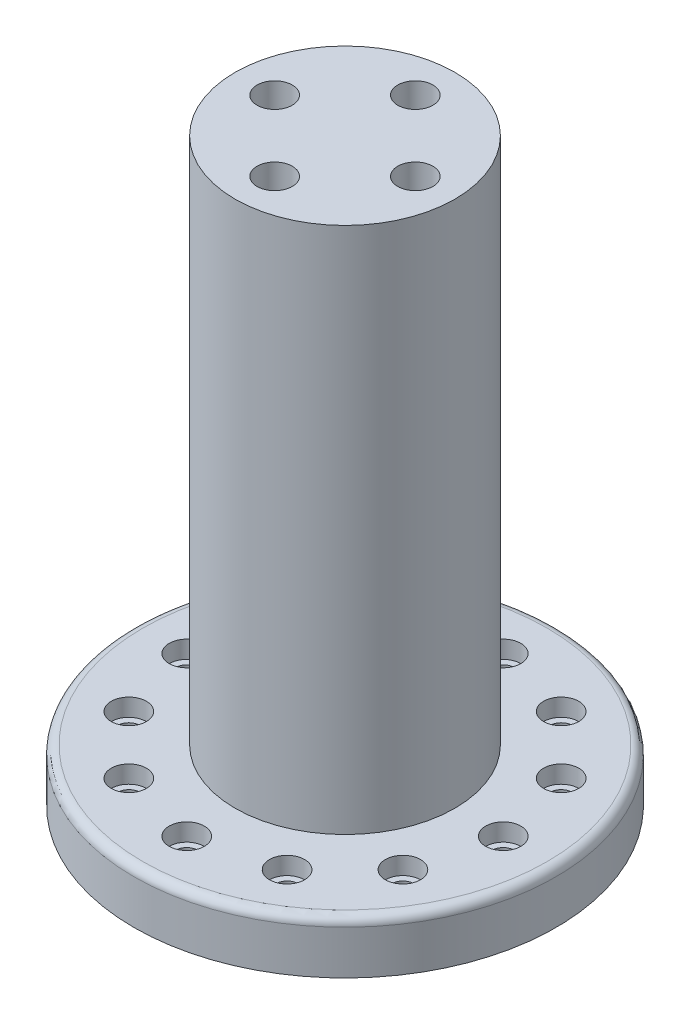
ISO-10303-21;
HEADER;
FILE_DESCRIPTION(('STEP AP214'),'2;1');
FILE_NAME('part.step','',(''),(''),'','','');
FILE_SCHEMA(('AUTOMOTIVE_DESIGN { 1 0 10303 214 1 1 1 1 }'));
ENDSEC;
DATA;
#1=APPLICATION_CONTEXT('core data for automotive mechanical design processes');
#2=APPLICATION_PROTOCOL_DEFINITION('international standard','automotive_design',2000,#1);
#3=PRODUCT_CONTEXT('',#1,'mechanical');
#4=PRODUCT('Part','Part','',(#3));
#5=PRODUCT_RELATED_PRODUCT_CATEGORY('part','',(#4));
#6=PRODUCT_DEFINITION_FORMATION('','',#4);
#7=PRODUCT_DEFINITION_CONTEXT('part definition',#1,'design');
#8=PRODUCT_DEFINITION('design','',#6,#7);
#9=PRODUCT_DEFINITION_SHAPE('','',#8);
#10=(LENGTH_UNIT() NAMED_UNIT(*) SI_UNIT(.MILLI.,.METRE.));
#11=(NAMED_UNIT(*) PLANE_ANGLE_UNIT() SI_UNIT($,.RADIAN.));
#12=(NAMED_UNIT(*) SI_UNIT($,.STERADIAN.) SOLID_ANGLE_UNIT());
#13=UNCERTAINTY_MEASURE_WITH_UNIT(LENGTH_MEASURE(1.E-05),#10,'distance_accuracy_value','');
#14=(GEOMETRIC_REPRESENTATION_CONTEXT(3) GLOBAL_UNCERTAINTY_ASSIGNED_CONTEXT((#13)) GLOBAL_UNIT_ASSIGNED_CONTEXT((#10,
#11,#12)) REPRESENTATION_CONTEXT('',''));
#15=CARTESIAN_POINT('',(0.,0.,0.));
#16=DIRECTION('',(0.,0.,1.));
#17=DIRECTION('',(1.,0.,0.));
#18=AXIS2_PLACEMENT_3D('',#15,#16,#17);
#19=CARTESIAN_POINT('',(0.,6.,0.));
#20=DIRECTION('',(0.,-1.,0.));
#21=DIRECTION('',(0.,0.,-1.));
#22=AXIS2_PLACEMENT_3D('',#19,#20,#21);
#23=CYLINDRICAL_SURFACE('',#22,24.);
#24=CARTESIAN_POINT('',(0.,5.,0.));
#25=DIRECTION('',(0.,1.,0.));
#26=DIRECTION('',(0.,0.,1.));
#27=AXIS2_PLACEMENT_3D('',#24,#25,#26);
#28=CIRCLE('',#27,24.);
#29=CARTESIAN_POINT('',(0.,5.,24.));
#30=VERTEX_POINT('',#29);
#31=EDGE_CURVE('E10',#30,#30,#28,.F.);
#32=ORIENTED_EDGE('',*,*,#31,.T.);
#33=EDGE_LOOP('',(#32));
#34=FACE_BOUND('',#33,.T.);
#35=CARTESIAN_POINT('',(0.,0.,0.));
#36=DIRECTION('',(0.,1.,0.));
#37=DIRECTION('',(0.,0.,1.));
#38=AXIS2_PLACEMENT_3D('',#35,#36,#37);
#39=CIRCLE('',#38,24.);
#40=CARTESIAN_POINT('',(0.,0.,24.));
#41=VERTEX_POINT('',#40);
#42=EDGE_CURVE('E43',#41,#41,#39,.T.);
#43=ORIENTED_EDGE('',*,*,#42,.T.);
#44=EDGE_LOOP('',(#43));
#45=FACE_BOUND('',#44,.T.);
#46=ADVANCED_FACE('F32',(#34,#45),#23,.T.);
#47=CARTESIAN_POINT('',(0.,6.,0.));
#48=DIRECTION('',(0.,1.,0.));
#49=DIRECTION('',(0.,0.,1.));
#50=AXIS2_PLACEMENT_3D('',#47,#48,#49);
#51=PLANE('',#50);
#52=CARTESIAN_POINT('',(0.,6.,0.));
#53=DIRECTION('',(0.,1.,0.));
#54=DIRECTION('',(0.,0.,1.));
#55=AXIS2_PLACEMENT_3D('',#52,#53,#54);
#56=CIRCLE('',#55,23.);
#57=CARTESIAN_POINT('',(0.,6.,23.));
#58=VERTEX_POINT('',#57);
#59=EDGE_CURVE('E39',#58,#58,#56,.T.);
#60=ORIENTED_EDGE('',*,*,#59,.T.);
#61=EDGE_LOOP('',(#60));
#62=FACE_BOUND('',#61,.T.);
#63=CARTESIAN_POINT('',(0.,6.,0.));
#64=DIRECTION('',(0.,1.,0.));
#65=DIRECTION('',(0.,0.,1.));
#66=AXIS2_PLACEMENT_3D('',#63,#64,#65);
#67=CIRCLE('',#66,12.5);
#68=CARTESIAN_POINT('',(0.,6.,12.5));
#69=VERTEX_POINT('',#68);
#70=EDGE_CURVE('E194',#69,#69,#67,.T.);
#71=ORIENTED_EDGE('',*,*,#70,.F.);
#72=EDGE_LOOP('',(#71));
#73=FACE_BOUND('',#72,.T.);
#74=CARTESIAN_POINT('',(-15.5884572681199,6.,9.00000000000001));
#75=DIRECTION('',(0.,1.,0.));
#76=DIRECTION('',(0.,0.,1.));
#77=AXIS2_PLACEMENT_3D('',#74,#75,#76);
#78=CIRCLE('',#77,2.);
#79=CARTESIAN_POINT('',(-15.5884572681199,6.,11.));
#80=VERTEX_POINT('',#79);
#81=EDGE_CURVE('E80',#80,#80,#78,.T.);
#82=ORIENTED_EDGE('',*,*,#81,.F.);
#83=EDGE_LOOP('',(#82));
#84=FACE_BOUND('',#83,.T.);
#85=CARTESIAN_POINT('',(-8.99999999999999,6.,15.5884572681199));
#86=DIRECTION('',(0.,1.,0.));
#87=DIRECTION('',(0.,0.,1.));
#88=AXIS2_PLACEMENT_3D('',#85,#86,#87);
#89=CIRCLE('',#88,2.);
#90=CARTESIAN_POINT('',(-8.99999999999999,6.,17.5884572681199));
#91=VERTEX_POINT('',#90);
#92=EDGE_CURVE('E87',#91,#91,#89,.T.);
#93=ORIENTED_EDGE('',*,*,#92,.F.);
#94=EDGE_LOOP('',(#93));
#95=FACE_BOUND('',#94,.T.);
#96=CARTESIAN_POINT('',(0.,6.,18.));
#97=DIRECTION('',(0.,1.,0.));
#98=DIRECTION('',(0.,0.,1.));
#99=AXIS2_PLACEMENT_3D('',#96,#97,#98);
#100=CIRCLE('',#99,2.);
#101=CARTESIAN_POINT('',(0.,6.,20.));
#102=VERTEX_POINT('',#101);
#103=EDGE_CURVE('E93',#102,#102,#100,.T.);
#104=ORIENTED_EDGE('',*,*,#103,.F.);
#105=EDGE_LOOP('',(#104));
#106=FACE_BOUND('',#105,.T.);
#107=CARTESIAN_POINT('',(9.00000000000001,6.,15.5884572681199));
#108=DIRECTION('',(0.,1.,0.));
#109=DIRECTION('',(0.,0.,1.));
#110=AXIS2_PLACEMENT_3D('',#107,#108,#109);
#111=CIRCLE('',#110,2.);
#112=CARTESIAN_POINT('',(9.00000000000001,6.,17.5884572681199));
#113=VERTEX_POINT('',#112);
#114=EDGE_CURVE('E99',#113,#113,#111,.T.);
#115=ORIENTED_EDGE('',*,*,#114,.F.);
#116=EDGE_LOOP('',(#115));
#117=FACE_BOUND('',#116,.T.);
#118=CARTESIAN_POINT('',(15.5884572681199,6.,8.99999999999999));
#119=DIRECTION('',(0.,1.,0.));
#120=DIRECTION('',(0.,0.,1.));
#121=AXIS2_PLACEMENT_3D('',#118,#119,#120);
#122=CIRCLE('',#121,2.);
#123=CARTESIAN_POINT('',(15.5884572681199,6.,11.));
#124=VERTEX_POINT('',#123);
#125=EDGE_CURVE('E56',#124,#124,#122,.T.);
#126=ORIENTED_EDGE('',*,*,#125,.F.);
#127=EDGE_LOOP('',(#126));
#128=FACE_BOUND('',#127,.T.);
#129=CARTESIAN_POINT('',(18.,6.,0.));
#130=DIRECTION('',(0.,1.,0.));
#131=DIRECTION('',(0.,0.,1.));
#132=AXIS2_PLACEMENT_3D('',#129,#130,#131);
#133=CIRCLE('',#132,2.);
#134=CARTESIAN_POINT('',(18.,6.,2.));
#135=VERTEX_POINT('',#134);
#136=EDGE_CURVE('E63',#135,#135,#133,.T.);
#137=ORIENTED_EDGE('',*,*,#136,.F.);
#138=EDGE_LOOP('',(#137));
#139=FACE_BOUND('',#138,.T.);
#140=CARTESIAN_POINT('',(15.5884572681199,6.,-9.));
#141=DIRECTION('',(0.,1.,0.));
#142=DIRECTION('',(0.,0.,1.));
#143=AXIS2_PLACEMENT_3D('',#140,#141,#142);
#144=CIRCLE('',#143,2.);
#145=CARTESIAN_POINT('',(15.5884572681199,6.,-7.));
#146=VERTEX_POINT('',#145);
#147=EDGE_CURVE('E69',#146,#146,#144,.T.);
#148=ORIENTED_EDGE('',*,*,#147,.F.);
#149=EDGE_LOOP('',(#148));
#150=FACE_BOUND('',#149,.T.);
#151=CARTESIAN_POINT('',(9.,6.,-15.5884572681199));
#152=DIRECTION('',(0.,1.,0.));
#153=DIRECTION('',(0.,0.,1.));
#154=AXIS2_PLACEMENT_3D('',#151,#152,#153);
#155=CIRCLE('',#154,2.);
#156=CARTESIAN_POINT('',(9.,6.,-13.5884572681199));
#157=VERTEX_POINT('',#156);
#158=EDGE_CURVE('E75',#157,#157,#155,.T.);
#159=ORIENTED_EDGE('',*,*,#158,.F.);
#160=EDGE_LOOP('',(#159));
#161=FACE_BOUND('',#160,.T.);
#162=CARTESIAN_POINT('',(-18.,6.,0.));
#163=DIRECTION('',(0.,1.,0.));
#164=DIRECTION('',(0.,0.,1.));
#165=AXIS2_PLACEMENT_3D('',#162,#163,#164);
#166=CIRCLE('',#165,2.);
#167=CARTESIAN_POINT('',(-18.,6.,2.));
#168=VERTEX_POINT('',#167);
#169=EDGE_CURVE('E117',#168,#168,#166,.T.);
#170=ORIENTED_EDGE('',*,*,#169,.F.);
#171=EDGE_LOOP('',(#170));
#172=FACE_BOUND('',#171,.T.);
#173=CARTESIAN_POINT('',(-15.5884572681199,6.,-8.99999999999999));
#174=DIRECTION('',(0.,1.,0.));
#175=DIRECTION('',(0.,0.,1.));
#176=AXIS2_PLACEMENT_3D('',#173,#174,#175);
#177=CIRCLE('',#176,2.);
#178=CARTESIAN_POINT('',(-15.5884572681199,6.,-6.99999999999999));
#179=VERTEX_POINT('',#178);
#180=EDGE_CURVE('E111',#179,#179,#177,.T.);
#181=ORIENTED_EDGE('',*,*,#180,.F.);
#182=EDGE_LOOP('',(#181));
#183=FACE_BOUND('',#182,.T.);
#184=CARTESIAN_POINT('',(-9.00000000000001,6.,-15.5884572681199));
#185=DIRECTION('',(0.,1.,0.));
#186=DIRECTION('',(0.,0.,1.));
#187=AXIS2_PLACEMENT_3D('',#184,#185,#186);
#188=CIRCLE('',#187,2.);
#189=CARTESIAN_POINT('',(-9.00000000000001,6.,-13.5884572681199));
#190=VERTEX_POINT('',#189);
#191=EDGE_CURVE('E104',#190,#190,#188,.T.);
#192=ORIENTED_EDGE('',*,*,#191,.F.);
#193=EDGE_LOOP('',(#192));
#194=FACE_BOUND('',#193,.T.);
#195=CARTESIAN_POINT('',(0.,6.,-18.));
#196=DIRECTION('',(0.,1.,0.));
#197=DIRECTION('',(0.,0.,1.));
#198=AXIS2_PLACEMENT_3D('',#195,#196,#197);
#199=CIRCLE('',#198,2.);
#200=CARTESIAN_POINT('',(0.,6.,-16.));
#201=VERTEX_POINT('',#200);
#202=EDGE_CURVE('E50',#201,#201,#199,.T.);
#203=ORIENTED_EDGE('',*,*,#202,.F.);
#204=EDGE_LOOP('',(#203));
#205=FACE_BOUND('',#204,.T.);
#206=ADVANCED_FACE('F259',(#62,#73,#84,#95,#106,#117,#128,#139,#150,#161,#172,#183,#194,#205),
#51,.T.);
#207=CARTESIAN_POINT('',(0.,0.,0.));
#208=DIRECTION('',(0.,1.,0.));
#209=DIRECTION('',(0.,0.,1.));
#210=AXIS2_PLACEMENT_3D('',#207,#208,#209);
#211=PLANE('',#210);
#212=CARTESIAN_POINT('',(0.,0.,0.));
#213=DIRECTION('',(0.,-1.,0.));
#214=DIRECTION('',(0.,0.,-1.));
#215=AXIS2_PLACEMENT_3D('',#212,#213,#214);
#216=CIRCLE('',#215,8.5);
#217=CARTESIAN_POINT('',(0.,0.,-8.5));
#218=VERTEX_POINT('',#217);
#219=EDGE_CURVE('E200',#218,#218,#216,.T.);
#220=ORIENTED_EDGE('',*,*,#219,.F.);
#221=EDGE_LOOP('',(#220));
#222=FACE_BOUND('',#221,.T.);
#223=CARTESIAN_POINT('',(-15.5884572681199,0.,9.00000000000001));
#224=DIRECTION('',(0.,1.,0.));
#225=DIRECTION('',(0.,0.,1.));
#226=AXIS2_PLACEMENT_3D('',#223,#224,#225);
#227=CIRCLE('',#226,1.25);
#228=CARTESIAN_POINT('',(-15.5884572681199,0.,10.25));
#229=VERTEX_POINT('',#228);
#230=EDGE_CURVE('E155',#229,#229,#227,.T.);
#231=ORIENTED_EDGE('',*,*,#230,.T.);
#232=EDGE_LOOP('',(#231));
#233=FACE_BOUND('',#232,.T.);
#234=CARTESIAN_POINT('',(-8.99999999999999,0.,15.5884572681199));
#235=DIRECTION('',(0.,1.,0.));
#236=DIRECTION('',(0.,0.,1.));
#237=AXIS2_PLACEMENT_3D('',#234,#235,#236);
#238=CIRCLE('',#237,1.25);
#239=CARTESIAN_POINT('',(-8.99999999999999,0.,16.8384572681199));
#240=VERTEX_POINT('',#239);
#241=EDGE_CURVE('E162',#240,#240,#238,.T.);
#242=ORIENTED_EDGE('',*,*,#241,.T.);
#243=EDGE_LOOP('',(#242));
#244=FACE_BOUND('',#243,.T.);
#245=CARTESIAN_POINT('',(0.,0.,18.));
#246=DIRECTION('',(0.,1.,0.));
#247=DIRECTION('',(0.,0.,1.));
#248=AXIS2_PLACEMENT_3D('',#245,#246,#247);
#249=CIRCLE('',#248,1.25);
#250=CARTESIAN_POINT('',(0.,0.,19.25));
#251=VERTEX_POINT('',#250);
#252=EDGE_CURVE('E168',#251,#251,#249,.T.);
#253=ORIENTED_EDGE('',*,*,#252,.T.);
#254=EDGE_LOOP('',(#253));
#255=FACE_BOUND('',#254,.T.);
#256=CARTESIAN_POINT('',(9.00000000000001,0.,15.5884572681199));
#257=DIRECTION('',(0.,1.,0.));
#258=DIRECTION('',(0.,0.,1.));
#259=AXIS2_PLACEMENT_3D('',#256,#257,#258);
#260=CIRCLE('',#259,1.25);
#261=CARTESIAN_POINT('',(9.00000000000001,0.,16.8384572681199));
#262=VERTEX_POINT('',#261);
#263=EDGE_CURVE('E132',#262,#262,#260,.T.);
#264=ORIENTED_EDGE('',*,*,#263,.T.);
#265=EDGE_LOOP('',(#264));
#266=FACE_BOUND('',#265,.T.);
#267=CARTESIAN_POINT('',(15.5884572681199,0.,9.));
#268=DIRECTION('',(0.,1.,0.));
#269=DIRECTION('',(0.,0.,1.));
#270=AXIS2_PLACEMENT_3D('',#267,#268,#269);
#271=CIRCLE('',#270,1.25);
#272=CARTESIAN_POINT('',(15.5884572681199,0.,10.25));
#273=VERTEX_POINT('',#272);
#274=EDGE_CURVE('E131',#273,#273,#271,.T.);
#275=ORIENTED_EDGE('',*,*,#274,.T.);
#276=EDGE_LOOP('',(#275));
#277=FACE_BOUND('',#276,.T.);
#278=CARTESIAN_POINT('',(18.,0.,0.));
#279=DIRECTION('',(0.,1.,0.));
#280=DIRECTION('',(0.,0.,1.));
#281=AXIS2_PLACEMENT_3D('',#278,#279,#280);
#282=CIRCLE('',#281,1.25);
#283=CARTESIAN_POINT('',(18.,0.,1.25));
#284=VERTEX_POINT('',#283);
#285=EDGE_CURVE('E138',#284,#284,#282,.T.);
#286=ORIENTED_EDGE('',*,*,#285,.T.);
#287=EDGE_LOOP('',(#286));
#288=FACE_BOUND('',#287,.T.);
#289=CARTESIAN_POINT('',(15.5884572681199,0.,-9.));
#290=DIRECTION('',(0.,1.,0.));
#291=DIRECTION('',(0.,0.,1.));
#292=AXIS2_PLACEMENT_3D('',#289,#290,#291);
#293=CIRCLE('',#292,1.25);
#294=CARTESIAN_POINT('',(15.5884572681199,0.,-7.75));
#295=VERTEX_POINT('',#294);
#296=EDGE_CURVE('E144',#295,#295,#293,.T.);
#297=ORIENTED_EDGE('',*,*,#296,.T.);
#298=EDGE_LOOP('',(#297));
#299=FACE_BOUND('',#298,.T.);
#300=CARTESIAN_POINT('',(9.,0.,-15.5884572681199));
#301=DIRECTION('',(0.,1.,0.));
#302=DIRECTION('',(0.,0.,1.));
#303=AXIS2_PLACEMENT_3D('',#300,#301,#302);
#304=CIRCLE('',#303,1.25);
#305=CARTESIAN_POINT('',(9.,0.,-14.3384572681199));
#306=VERTEX_POINT('',#305);
#307=EDGE_CURVE('E125',#306,#306,#304,.T.);
#308=ORIENTED_EDGE('',*,*,#307,.T.);
#309=EDGE_LOOP('',(#308));
#310=FACE_BOUND('',#309,.T.);
#311=CARTESIAN_POINT('',(-18.,0.,0.));
#312=DIRECTION('',(0.,1.,0.));
#313=DIRECTION('',(0.,0.,1.));
#314=AXIS2_PLACEMENT_3D('',#311,#312,#313);
#315=CIRCLE('',#314,1.25);
#316=CARTESIAN_POINT('',(-18.,0.,1.25));
#317=VERTEX_POINT('',#316);
#318=EDGE_CURVE('E156',#317,#317,#315,.T.);
#319=ORIENTED_EDGE('',*,*,#318,.T.);
#320=EDGE_LOOP('',(#319));
#321=FACE_BOUND('',#320,.T.);
#322=CARTESIAN_POINT('',(-15.5884572681199,0.,-8.99999999999999));
#323=DIRECTION('',(0.,1.,0.));
#324=DIRECTION('',(0.,0.,1.));
#325=AXIS2_PLACEMENT_3D('',#322,#323,#324);
#326=CIRCLE('',#325,1.25);
#327=CARTESIAN_POINT('',(-15.5884572681199,0.,-7.74999999999999));
#328=VERTEX_POINT('',#327);
#329=EDGE_CURVE('E186',#328,#328,#326,.T.);
#330=ORIENTED_EDGE('',*,*,#329,.T.);
#331=EDGE_LOOP('',(#330));
#332=FACE_BOUND('',#331,.T.);
#333=CARTESIAN_POINT('',(-9.00000000000001,0.,-15.5884572681199));
#334=DIRECTION('',(0.,1.,0.));
#335=DIRECTION('',(0.,0.,1.));
#336=AXIS2_PLACEMENT_3D('',#333,#334,#335);
#337=CIRCLE('',#336,1.25);
#338=CARTESIAN_POINT('',(-9.00000000000001,0.,-14.3384572681199));
#339=VERTEX_POINT('',#338);
#340=EDGE_CURVE('E179',#339,#339,#337,.T.);
#341=ORIENTED_EDGE('',*,*,#340,.T.);
#342=EDGE_LOOP('',(#341));
#343=FACE_BOUND('',#342,.T.);
#344=CARTESIAN_POINT('',(0.,0.,-18.));
#345=DIRECTION('',(0.,1.,0.));
#346=DIRECTION('',(0.,0.,1.));
#347=AXIS2_PLACEMENT_3D('',#344,#345,#346);
#348=CIRCLE('',#347,1.25);
#349=CARTESIAN_POINT('',(0.,0.,-16.75));
#350=VERTEX_POINT('',#349);
#351=EDGE_CURVE('E108',#350,#350,#348,.T.);
#352=ORIENTED_EDGE('',*,*,#351,.T.);
#353=EDGE_LOOP('',(#352));
#354=FACE_BOUND('',#353,.T.);
#355=ORIENTED_EDGE('',*,*,#42,.F.);
#356=EDGE_LOOP('',(#355));
#357=FACE_BOUND('',#356,.T.);
#358=ADVANCED_FACE('F262',(#222,#233,#244,#255,#266,#277,#288,#299,#310,#321,#332,#343,#354,
#357),#211,.F.);
#359=CARTESIAN_POINT('',(0.,4.,-18.));
#360=DIRECTION('',(0.,1.,0.));
#361=DIRECTION('',(0.,0.,1.));
#362=AXIS2_PLACEMENT_3D('',#359,#360,#361);
#363=CYLINDRICAL_SURFACE('',#362,2.);
#364=CARTESIAN_POINT('',(0.,4.,-18.));
#365=DIRECTION('',(0.,1.,0.));
#366=DIRECTION('',(0.,0.,1.));
#367=AXIS2_PLACEMENT_3D('',#364,#365,#366);
#368=CIRCLE('',#367,2.);
#369=CARTESIAN_POINT('',(0.,4.,-16.));
#370=VERTEX_POINT('',#369);
#371=EDGE_CURVE('E47',#370,#370,#368,.T.);
#372=ORIENTED_EDGE('',*,*,#371,.F.);
#373=EDGE_LOOP('',(#372));
#374=FACE_BOUND('',#373,.T.);
#375=ORIENTED_EDGE('',*,*,#202,.T.);
#376=EDGE_LOOP('',(#375));
#377=FACE_BOUND('',#376,.T.);
#378=ADVANCED_FACE('F288',(#374,#377),#363,.F.);
#379=CARTESIAN_POINT('',(0.,4.,-18.));
#380=DIRECTION('',(0.,1.,0.));
#381=DIRECTION('',(0.,0.,1.));
#382=AXIS2_PLACEMENT_3D('',#379,#380,#381);
#383=PLANE('',#382);
#384=CARTESIAN_POINT('',(0.,4.,-18.));
#385=DIRECTION('',(0.,1.,0.));
#386=DIRECTION('',(0.,0.,1.));
#387=AXIS2_PLACEMENT_3D('',#384,#385,#386);
#388=CIRCLE('',#387,1.25);
#389=CARTESIAN_POINT('',(0.,4.,-16.75));
#390=VERTEX_POINT('',#389);
#391=EDGE_CURVE('E122',#390,#390,#388,.T.);
#392=ORIENTED_EDGE('',*,*,#391,.F.);
#393=EDGE_LOOP('',(#392));
#394=FACE_BOUND('',#393,.T.);
#395=ORIENTED_EDGE('',*,*,#371,.T.);
#396=EDGE_LOOP('',(#395));
#397=FACE_BOUND('',#396,.T.);
#398=ADVANCED_FACE('F290',(#394,#397),#383,.T.);
#399=CARTESIAN_POINT('',(-9.00000000000001,4.,-15.5884572681199));
#400=DIRECTION('',(0.,1.,0.));
#401=DIRECTION('',(0.,0.,1.));
#402=AXIS2_PLACEMENT_3D('',#399,#400,#401);
#403=CYLINDRICAL_SURFACE('',#402,2.);
#404=CARTESIAN_POINT('',(-9.00000000000001,4.,-15.5884572681199));
#405=DIRECTION('',(0.,1.,0.));
#406=DIRECTION('',(0.,0.,1.));
#407=AXIS2_PLACEMENT_3D('',#404,#405,#406);
#408=CIRCLE('',#407,2.);
#409=CARTESIAN_POINT('',(-9.00000000000001,4.,-13.5884572681199));
#410=VERTEX_POINT('',#409);
#411=EDGE_CURVE('E107',#410,#410,#408,.T.);
#412=ORIENTED_EDGE('',*,*,#411,.F.);
#413=EDGE_LOOP('',(#412));
#414=FACE_BOUND('',#413,.T.);
#415=ORIENTED_EDGE('',*,*,#191,.T.);
#416=EDGE_LOOP('',(#415));
#417=FACE_BOUND('',#416,.T.);
#418=ADVANCED_FACE('F297',(#414,#417),#403,.F.);
#419=CARTESIAN_POINT('',(-9.00000000000001,4.,-15.5884572681199));
#420=DIRECTION('',(0.,1.,0.));
#421=DIRECTION('',(0.,0.,1.));
#422=AXIS2_PLACEMENT_3D('',#419,#420,#421);
#423=PLANE('',#422);
#424=CARTESIAN_POINT('',(-9.00000000000001,4.,-15.5884572681199));
#425=DIRECTION('',(0.,1.,0.));
#426=DIRECTION('',(0.,0.,1.));
#427=AXIS2_PLACEMENT_3D('',#424,#425,#426);
#428=CIRCLE('',#427,1.25);
#429=CARTESIAN_POINT('',(-9.00000000000001,4.,-14.3384572681199));
#430=VERTEX_POINT('',#429);
#431=EDGE_CURVE('E176',#430,#430,#428,.T.);
#432=ORIENTED_EDGE('',*,*,#431,.F.);
#433=EDGE_LOOP('',(#432));
#434=FACE_BOUND('',#433,.T.);
#435=ORIENTED_EDGE('',*,*,#411,.T.);
#436=EDGE_LOOP('',(#435));
#437=FACE_BOUND('',#436,.T.);
#438=ADVANCED_FACE('F493',(#434,#437),#423,.T.);
#439=CARTESIAN_POINT('',(-15.5884572681199,4.,-8.99999999999999));
#440=DIRECTION('',(0.,1.,0.));
#441=DIRECTION('',(0.,0.,1.));
#442=AXIS2_PLACEMENT_3D('',#439,#440,#441);
#443=CYLINDRICAL_SURFACE('',#442,2.);
#444=CARTESIAN_POINT('',(-15.5884572681199,4.,-8.99999999999999));
#445=DIRECTION('',(0.,1.,0.));
#446=DIRECTION('',(0.,0.,1.));
#447=AXIS2_PLACEMENT_3D('',#444,#445,#446);
#448=CIRCLE('',#447,2.);
#449=CARTESIAN_POINT('',(-15.5884572681199,4.,-6.99999999999999));
#450=VERTEX_POINT('',#449);
#451=EDGE_CURVE('E114',#450,#450,#448,.T.);
#452=ORIENTED_EDGE('',*,*,#451,.F.);
#453=EDGE_LOOP('',(#452));
#454=FACE_BOUND('',#453,.T.);
#455=ORIENTED_EDGE('',*,*,#180,.T.);
#456=EDGE_LOOP('',(#455));
#457=FACE_BOUND('',#456,.T.);
#458=ADVANCED_FACE('F489',(#454,#457),#443,.F.);
#459=CARTESIAN_POINT('',(-15.5884572681199,4.,-8.99999999999999));
#460=DIRECTION('',(0.,1.,0.));
#461=DIRECTION('',(0.,0.,1.));
#462=AXIS2_PLACEMENT_3D('',#459,#460,#461);
#463=PLANE('',#462);
#464=CARTESIAN_POINT('',(-15.5884572681199,4.,-8.99999999999999));
#465=DIRECTION('',(0.,1.,0.));
#466=DIRECTION('',(0.,0.,1.));
#467=AXIS2_PLACEMENT_3D('',#464,#465,#466);
#468=CIRCLE('',#467,1.25);
#469=CARTESIAN_POINT('',(-15.5884572681199,4.,-7.74999999999999));
#470=VERTEX_POINT('',#469);
#471=EDGE_CURVE('E183',#470,#470,#468,.T.);
#472=ORIENTED_EDGE('',*,*,#471,.F.);
#473=EDGE_LOOP('',(#472));
#474=FACE_BOUND('',#473,.T.);
#475=ORIENTED_EDGE('',*,*,#451,.T.);
#476=EDGE_LOOP('',(#475));
#477=FACE_BOUND('',#476,.T.);
#478=ADVANCED_FACE('F485',(#474,#477),#463,.T.);
#479=CARTESIAN_POINT('',(-18.,4.,0.));
#480=DIRECTION('',(0.,1.,0.));
#481=DIRECTION('',(0.,0.,1.));
#482=AXIS2_PLACEMENT_3D('',#479,#480,#481);
#483=CYLINDRICAL_SURFACE('',#482,2.);
#484=CARTESIAN_POINT('',(-18.,4.,0.));
#485=DIRECTION('',(0.,1.,0.));
#486=DIRECTION('',(0.,0.,1.));
#487=AXIS2_PLACEMENT_3D('',#484,#485,#486);
#488=CIRCLE('',#487,2.);
#489=CARTESIAN_POINT('',(-18.,4.,2.));
#490=VERTEX_POINT('',#489);
#491=EDGE_CURVE('E84',#490,#490,#488,.T.);
#492=ORIENTED_EDGE('',*,*,#491,.F.);
#493=EDGE_LOOP('',(#492));
#494=FACE_BOUND('',#493,.T.);
#495=ORIENTED_EDGE('',*,*,#169,.T.);
#496=EDGE_LOOP('',(#495));
#497=FACE_BOUND('',#496,.T.);
#498=ADVANCED_FACE('F481',(#494,#497),#483,.F.);
#499=CARTESIAN_POINT('',(-18.,4.,0.));
#500=DIRECTION('',(0.,1.,0.));
#501=DIRECTION('',(0.,0.,1.));
#502=AXIS2_PLACEMENT_3D('',#499,#500,#501);
#503=PLANE('',#502);
#504=CARTESIAN_POINT('',(-18.,4.,0.));
#505=DIRECTION('',(0.,1.,0.));
#506=DIRECTION('',(0.,0.,1.));
#507=AXIS2_PLACEMENT_3D('',#504,#505,#506);
#508=CIRCLE('',#507,1.25);
#509=CARTESIAN_POINT('',(-18.,4.,1.25));
#510=VERTEX_POINT('',#509);
#511=EDGE_CURVE('E189',#510,#510,#508,.T.);
#512=ORIENTED_EDGE('',*,*,#511,.F.);
#513=EDGE_LOOP('',(#512));
#514=FACE_BOUND('',#513,.T.);
#515=ORIENTED_EDGE('',*,*,#491,.T.);
#516=EDGE_LOOP('',(#515));
#517=FACE_BOUND('',#516,.T.);
#518=ADVANCED_FACE('F477',(#514,#517),#503,.T.);
#519=CARTESIAN_POINT('',(9.,4.,-15.5884572681199));
#520=DIRECTION('',(0.,1.,0.));
#521=DIRECTION('',(0.,0.,1.));
#522=AXIS2_PLACEMENT_3D('',#519,#520,#521);
#523=CYLINDRICAL_SURFACE('',#522,2.);
#524=CARTESIAN_POINT('',(9.,4.,-15.5884572681199));
#525=DIRECTION('',(0.,1.,0.));
#526=DIRECTION('',(0.,0.,1.));
#527=AXIS2_PLACEMENT_3D('',#524,#525,#526);
#528=CIRCLE('',#527,2.);
#529=CARTESIAN_POINT('',(9.,4.,-13.5884572681199));
#530=VERTEX_POINT('',#529);
#531=EDGE_CURVE('E53',#530,#530,#528,.T.);
#532=ORIENTED_EDGE('',*,*,#531,.F.);
#533=EDGE_LOOP('',(#532));
#534=FACE_BOUND('',#533,.T.);
#535=ORIENTED_EDGE('',*,*,#158,.T.);
#536=EDGE_LOOP('',(#535));
#537=FACE_BOUND('',#536,.T.);
#538=ADVANCED_FACE('F480',(#534,#537),#523,.F.);
#539=CARTESIAN_POINT('',(9.,4.,-15.5884572681199));
#540=DIRECTION('',(0.,1.,0.));
#541=DIRECTION('',(0.,0.,1.));
#542=AXIS2_PLACEMENT_3D('',#539,#540,#541);
#543=PLANE('',#542);
#544=CARTESIAN_POINT('',(9.,4.,-15.5884572681199));
#545=DIRECTION('',(0.,1.,0.));
#546=DIRECTION('',(0.,0.,1.));
#547=AXIS2_PLACEMENT_3D('',#544,#545,#546);
#548=CIRCLE('',#547,1.25);
#549=CARTESIAN_POINT('',(9.,4.,-14.3384572681199));
#550=VERTEX_POINT('',#549);
#551=EDGE_CURVE('E147',#550,#550,#548,.T.);
#552=ORIENTED_EDGE('',*,*,#551,.F.);
#553=EDGE_LOOP('',(#552));
#554=FACE_BOUND('',#553,.T.);
#555=ORIENTED_EDGE('',*,*,#531,.T.);
#556=EDGE_LOOP('',(#555));
#557=FACE_BOUND('',#556,.T.);
#558=ADVANCED_FACE('F533',(#554,#557),#543,.T.);
#559=CARTESIAN_POINT('',(15.5884572681199,4.,-9.));
#560=DIRECTION('',(0.,1.,0.));
#561=DIRECTION('',(0.,0.,1.));
#562=AXIS2_PLACEMENT_3D('',#559,#560,#561);
#563=CYLINDRICAL_SURFACE('',#562,2.);
#564=CARTESIAN_POINT('',(15.5884572681199,4.,-9.));
#565=DIRECTION('',(0.,1.,0.));
#566=DIRECTION('',(0.,0.,1.));
#567=AXIS2_PLACEMENT_3D('',#564,#565,#566);
#568=CIRCLE('',#567,2.);
#569=CARTESIAN_POINT('',(15.5884572681199,4.,-7.));
#570=VERTEX_POINT('',#569);
#571=EDGE_CURVE('E72',#570,#570,#568,.T.);
#572=ORIENTED_EDGE('',*,*,#571,.F.);
#573=EDGE_LOOP('',(#572));
#574=FACE_BOUND('',#573,.T.);
#575=ORIENTED_EDGE('',*,*,#147,.T.);
#576=EDGE_LOOP('',(#575));
#577=FACE_BOUND('',#576,.T.);
#578=ADVANCED_FACE('F536',(#574,#577),#563,.F.);
#579=CARTESIAN_POINT('',(15.5884572681199,4.,-9.));
#580=DIRECTION('',(0.,1.,0.));
#581=DIRECTION('',(0.,0.,1.));
#582=AXIS2_PLACEMENT_3D('',#579,#580,#581);
#583=PLANE('',#582);
#584=CARTESIAN_POINT('',(15.5884572681199,4.,-9.));
#585=DIRECTION('',(0.,1.,0.));
#586=DIRECTION('',(0.,0.,1.));
#587=AXIS2_PLACEMENT_3D('',#584,#585,#586);
#588=CIRCLE('',#587,1.25);
#589=CARTESIAN_POINT('',(15.5884572681199,4.,-7.75));
#590=VERTEX_POINT('',#589);
#591=EDGE_CURVE('E141',#590,#590,#588,.T.);
#592=ORIENTED_EDGE('',*,*,#591,.F.);
#593=EDGE_LOOP('',(#592));
#594=FACE_BOUND('',#593,.T.);
#595=ORIENTED_EDGE('',*,*,#571,.T.);
#596=EDGE_LOOP('',(#595));
#597=FACE_BOUND('',#596,.T.);
#598=ADVANCED_FACE('F541',(#594,#597),#583,.T.);
#599=CARTESIAN_POINT('',(18.,4.,0.));
#600=DIRECTION('',(0.,1.,0.));
#601=DIRECTION('',(0.,0.,1.));
#602=AXIS2_PLACEMENT_3D('',#599,#600,#601);
#603=CYLINDRICAL_SURFACE('',#602,2.);
#604=CARTESIAN_POINT('',(18.,4.,0.));
#605=DIRECTION('',(0.,1.,0.));
#606=DIRECTION('',(0.,0.,1.));
#607=AXIS2_PLACEMENT_3D('',#604,#605,#606);
#608=CIRCLE('',#607,2.);
#609=CARTESIAN_POINT('',(18.,4.,2.));
#610=VERTEX_POINT('',#609);
#611=EDGE_CURVE('E66',#610,#610,#608,.T.);
#612=ORIENTED_EDGE('',*,*,#611,.F.);
#613=EDGE_LOOP('',(#612));
#614=FACE_BOUND('',#613,.T.);
#615=ORIENTED_EDGE('',*,*,#136,.T.);
#616=EDGE_LOOP('',(#615));
#617=FACE_BOUND('',#616,.T.);
#618=ADVANCED_FACE('F544',(#614,#617),#603,.F.);
#619=CARTESIAN_POINT('',(18.,4.,0.));
#620=DIRECTION('',(0.,1.,0.));
#621=DIRECTION('',(0.,0.,1.));
#622=AXIS2_PLACEMENT_3D('',#619,#620,#621);
#623=PLANE('',#622);
#624=CARTESIAN_POINT('',(18.,4.,0.));
#625=DIRECTION('',(0.,1.,0.));
#626=DIRECTION('',(0.,0.,1.));
#627=AXIS2_PLACEMENT_3D('',#624,#625,#626);
#628=CIRCLE('',#627,1.25);
#629=CARTESIAN_POINT('',(18.,4.,1.25));
#630=VERTEX_POINT('',#629);
#631=EDGE_CURVE('E135',#630,#630,#628,.T.);
#632=ORIENTED_EDGE('',*,*,#631,.F.);
#633=EDGE_LOOP('',(#632));
#634=FACE_BOUND('',#633,.T.);
#635=ORIENTED_EDGE('',*,*,#611,.T.);
#636=EDGE_LOOP('',(#635));
#637=FACE_BOUND('',#636,.T.);
#638=ADVANCED_FACE('F549',(#634,#637),#623,.T.);
#639=CARTESIAN_POINT('',(15.5884572681199,4.,8.99999999999999));
#640=DIRECTION('',(0.,1.,0.));
#641=DIRECTION('',(0.,0.,1.));
#642=AXIS2_PLACEMENT_3D('',#639,#640,#641);
#643=CYLINDRICAL_SURFACE('',#642,2.);
#644=CARTESIAN_POINT('',(15.5884572681199,4.,8.99999999999999));
#645=DIRECTION('',(0.,1.,0.));
#646=DIRECTION('',(0.,0.,1.));
#647=AXIS2_PLACEMENT_3D('',#644,#645,#646);
#648=CIRCLE('',#647,2.);
#649=CARTESIAN_POINT('',(15.5884572681199,4.,11.));
#650=VERTEX_POINT('',#649);
#651=EDGE_CURVE('E59',#650,#650,#648,.T.);
#652=ORIENTED_EDGE('',*,*,#651,.F.);
#653=EDGE_LOOP('',(#652));
#654=FACE_BOUND('',#653,.T.);
#655=ORIENTED_EDGE('',*,*,#125,.T.);
#656=EDGE_LOOP('',(#655));
#657=FACE_BOUND('',#656,.T.);
#658=ADVANCED_FACE('F552',(#654,#657),#643,.F.);
#659=CARTESIAN_POINT('',(15.5884572681199,4.,8.99999999999999));
#660=DIRECTION('',(0.,1.,0.));
#661=DIRECTION('',(0.,0.,1.));
#662=AXIS2_PLACEMENT_3D('',#659,#660,#661);
#663=PLANE('',#662);
#664=CARTESIAN_POINT('',(15.5884572681199,4.,9.));
#665=DIRECTION('',(0.,1.,0.));
#666=DIRECTION('',(0.,0.,1.));
#667=AXIS2_PLACEMENT_3D('',#664,#665,#666);
#668=CIRCLE('',#667,1.25);
#669=CARTESIAN_POINT('',(15.5884572681199,4.,10.25));
#670=VERTEX_POINT('',#669);
#671=EDGE_CURVE('E128',#670,#670,#668,.T.);
#672=ORIENTED_EDGE('',*,*,#671,.F.);
#673=EDGE_LOOP('',(#672));
#674=FACE_BOUND('',#673,.T.);
#675=ORIENTED_EDGE('',*,*,#651,.T.);
#676=EDGE_LOOP('',(#675));
#677=FACE_BOUND('',#676,.T.);
#678=ADVANCED_FACE('F509',(#674,#677),#663,.T.);
#679=CARTESIAN_POINT('',(9.00000000000001,4.,15.5884572681199));
#680=DIRECTION('',(0.,1.,0.));
#681=DIRECTION('',(0.,0.,1.));
#682=AXIS2_PLACEMENT_3D('',#679,#680,#681);
#683=CYLINDRICAL_SURFACE('',#682,2.);
#684=CARTESIAN_POINT('',(9.00000000000001,4.,15.5884572681199));
#685=DIRECTION('',(0.,1.,0.));
#686=DIRECTION('',(0.,0.,1.));
#687=AXIS2_PLACEMENT_3D('',#684,#685,#686);
#688=CIRCLE('',#687,2.);
#689=CARTESIAN_POINT('',(9.00000000000001,4.,17.5884572681199));
#690=VERTEX_POINT('',#689);
#691=EDGE_CURVE('E60',#690,#690,#688,.T.);
#692=ORIENTED_EDGE('',*,*,#691,.F.);
#693=EDGE_LOOP('',(#692));
#694=FACE_BOUND('',#693,.T.);
#695=ORIENTED_EDGE('',*,*,#114,.T.);
#696=EDGE_LOOP('',(#695));
#697=FACE_BOUND('',#696,.T.);
#698=ADVANCED_FACE('F505',(#694,#697),#683,.F.);
#699=CARTESIAN_POINT('',(9.00000000000001,4.,15.5884572681199));
#700=DIRECTION('',(0.,1.,0.));
#701=DIRECTION('',(0.,0.,1.));
#702=AXIS2_PLACEMENT_3D('',#699,#700,#701);
#703=PLANE('',#702);
#704=CARTESIAN_POINT('',(9.00000000000001,4.,15.5884572681199));
#705=DIRECTION('',(0.,1.,0.));
#706=DIRECTION('',(0.,0.,1.));
#707=AXIS2_PLACEMENT_3D('',#704,#705,#706);
#708=CIRCLE('',#707,1.25);
#709=CARTESIAN_POINT('',(9.00000000000001,4.,16.8384572681199));
#710=VERTEX_POINT('',#709);
#711=EDGE_CURVE('E171',#710,#710,#708,.T.);
#712=ORIENTED_EDGE('',*,*,#711,.F.);
#713=EDGE_LOOP('',(#712));
#714=FACE_BOUND('',#713,.T.);
#715=ORIENTED_EDGE('',*,*,#691,.T.);
#716=EDGE_LOOP('',(#715));
#717=FACE_BOUND('',#716,.T.);
#718=ADVANCED_FACE('F501',(#714,#717),#703,.T.);
#719=CARTESIAN_POINT('',(0.,4.,18.));
#720=DIRECTION('',(0.,1.,0.));
#721=DIRECTION('',(0.,0.,1.));
#722=AXIS2_PLACEMENT_3D('',#719,#720,#721);
#723=CYLINDRICAL_SURFACE('',#722,2.);
#724=CARTESIAN_POINT('',(0.,4.,18.));
#725=DIRECTION('',(0.,1.,0.));
#726=DIRECTION('',(0.,0.,1.));
#727=AXIS2_PLACEMENT_3D('',#724,#725,#726);
#728=CIRCLE('',#727,2.);
#729=CARTESIAN_POINT('',(0.,4.,20.));
#730=VERTEX_POINT('',#729);
#731=EDGE_CURVE('E96',#730,#730,#728,.T.);
#732=ORIENTED_EDGE('',*,*,#731,.F.);
#733=EDGE_LOOP('',(#732));
#734=FACE_BOUND('',#733,.T.);
#735=ORIENTED_EDGE('',*,*,#103,.T.);
#736=EDGE_LOOP('',(#735));
#737=FACE_BOUND('',#736,.T.);
#738=ADVANCED_FACE('F504',(#734,#737),#723,.F.);
#739=CARTESIAN_POINT('',(0.,4.,18.));
#740=DIRECTION('',(0.,1.,0.));
#741=DIRECTION('',(0.,0.,1.));
#742=AXIS2_PLACEMENT_3D('',#739,#740,#741);
#743=PLANE('',#742);
#744=CARTESIAN_POINT('',(0.,4.,18.));
#745=DIRECTION('',(0.,1.,0.));
#746=DIRECTION('',(0.,0.,1.));
#747=AXIS2_PLACEMENT_3D('',#744,#745,#746);
#748=CIRCLE('',#747,1.25);
#749=CARTESIAN_POINT('',(0.,4.,19.25));
#750=VERTEX_POINT('',#749);
#751=EDGE_CURVE('E165',#750,#750,#748,.T.);
#752=ORIENTED_EDGE('',*,*,#751,.F.);
#753=EDGE_LOOP('',(#752));
#754=FACE_BOUND('',#753,.T.);
#755=ORIENTED_EDGE('',*,*,#731,.T.);
#756=EDGE_LOOP('',(#755));
#757=FACE_BOUND('',#756,.T.);
#758=ADVANCED_FACE('F511',(#754,#757),#743,.T.);
#759=CARTESIAN_POINT('',(-8.99999999999999,4.,15.5884572681199));
#760=DIRECTION('',(0.,1.,0.));
#761=DIRECTION('',(0.,0.,1.));
#762=AXIS2_PLACEMENT_3D('',#759,#760,#761);
#763=CYLINDRICAL_SURFACE('',#762,2.);
#764=CARTESIAN_POINT('',(-8.99999999999999,4.,15.5884572681199));
#765=DIRECTION('',(0.,1.,0.));
#766=DIRECTION('',(0.,0.,1.));
#767=AXIS2_PLACEMENT_3D('',#764,#765,#766);
#768=CIRCLE('',#767,2.);
#769=CARTESIAN_POINT('',(-8.99999999999999,4.,17.5884572681199));
#770=VERTEX_POINT('',#769);
#771=EDGE_CURVE('E90',#770,#770,#768,.T.);
#772=ORIENTED_EDGE('',*,*,#771,.F.);
#773=EDGE_LOOP('',(#772));
#774=FACE_BOUND('',#773,.T.);
#775=ORIENTED_EDGE('',*,*,#92,.T.);
#776=EDGE_LOOP('',(#775));
#777=FACE_BOUND('',#776,.T.);
#778=ADVANCED_FACE('F514',(#774,#777),#763,.F.);
#779=CARTESIAN_POINT('',(-8.99999999999999,4.,15.5884572681199));
#780=DIRECTION('',(0.,1.,0.));
#781=DIRECTION('',(0.,0.,1.));
#782=AXIS2_PLACEMENT_3D('',#779,#780,#781);
#783=PLANE('',#782);
#784=CARTESIAN_POINT('',(-8.99999999999999,4.,15.5884572681199));
#785=DIRECTION('',(0.,1.,0.));
#786=DIRECTION('',(0.,0.,1.));
#787=AXIS2_PLACEMENT_3D('',#784,#785,#786);
#788=CIRCLE('',#787,1.25);
#789=CARTESIAN_POINT('',(-8.99999999999999,4.,16.8384572681199));
#790=VERTEX_POINT('',#789);
#791=EDGE_CURVE('E159',#790,#790,#788,.T.);
#792=ORIENTED_EDGE('',*,*,#791,.F.);
#793=EDGE_LOOP('',(#792));
#794=FACE_BOUND('',#793,.T.);
#795=ORIENTED_EDGE('',*,*,#771,.T.);
#796=EDGE_LOOP('',(#795));
#797=FACE_BOUND('',#796,.T.);
#798=ADVANCED_FACE('F519',(#794,#797),#783,.T.);
#799=CARTESIAN_POINT('',(-15.5884572681199,4.,9.00000000000001));
#800=DIRECTION('',(0.,1.,0.));
#801=DIRECTION('',(0.,0.,1.));
#802=AXIS2_PLACEMENT_3D('',#799,#800,#801);
#803=CYLINDRICAL_SURFACE('',#802,2.);
#804=CARTESIAN_POINT('',(-15.5884572681199,4.,9.00000000000001));
#805=DIRECTION('',(0.,1.,0.));
#806=DIRECTION('',(0.,0.,1.));
#807=AXIS2_PLACEMENT_3D('',#804,#805,#806);
#808=CIRCLE('',#807,2.);
#809=CARTESIAN_POINT('',(-15.5884572681199,4.,11.));
#810=VERTEX_POINT('',#809);
#811=EDGE_CURVE('E83',#810,#810,#808,.T.);
#812=ORIENTED_EDGE('',*,*,#811,.F.);
#813=EDGE_LOOP('',(#812));
#814=FACE_BOUND('',#813,.T.);
#815=ORIENTED_EDGE('',*,*,#81,.T.);
#816=EDGE_LOOP('',(#815));
#817=FACE_BOUND('',#816,.T.);
#818=ADVANCED_FACE('F522',(#814,#817),#803,.F.);
#819=CARTESIAN_POINT('',(-15.5884572681199,4.,9.00000000000001));
#820=DIRECTION('',(0.,1.,0.));
#821=DIRECTION('',(0.,0.,1.));
#822=AXIS2_PLACEMENT_3D('',#819,#820,#821);
#823=PLANE('',#822);
#824=CARTESIAN_POINT('',(-15.5884572681199,4.,9.00000000000001));
#825=DIRECTION('',(0.,1.,0.));
#826=DIRECTION('',(0.,0.,1.));
#827=AXIS2_PLACEMENT_3D('',#824,#825,#826);
#828=CIRCLE('',#827,1.25);
#829=CARTESIAN_POINT('',(-15.5884572681199,4.,10.25));
#830=VERTEX_POINT('',#829);
#831=EDGE_CURVE('E152',#830,#830,#828,.T.);
#832=ORIENTED_EDGE('',*,*,#831,.F.);
#833=EDGE_LOOP('',(#832));
#834=FACE_BOUND('',#833,.T.);
#835=ORIENTED_EDGE('',*,*,#811,.T.);
#836=EDGE_LOOP('',(#835));
#837=FACE_BOUND('',#836,.T.);
#838=ADVANCED_FACE('F475',(#834,#837),#823,.T.);
#839=CARTESIAN_POINT('',(0.,0.,-18.));
#840=DIRECTION('',(0.,1.,0.));
#841=DIRECTION('',(0.,0.,1.));
#842=AXIS2_PLACEMENT_3D('',#839,#840,#841);
#843=CYLINDRICAL_SURFACE('',#842,1.25);
#844=ORIENTED_EDGE('',*,*,#351,.F.);
#845=EDGE_LOOP('',(#844));
#846=FACE_BOUND('',#845,.T.);
#847=ORIENTED_EDGE('',*,*,#391,.T.);
#848=EDGE_LOOP('',(#847));
#849=FACE_BOUND('',#848,.T.);
#850=ADVANCED_FACE('F441',(#846,#849),#843,.F.);
#851=CARTESIAN_POINT('',(-9.00000000000001,0.,-15.5884572681199));
#852=DIRECTION('',(0.,1.,0.));
#853=DIRECTION('',(0.,0.,1.));
#854=AXIS2_PLACEMENT_3D('',#851,#852,#853);
#855=CYLINDRICAL_SURFACE('',#854,1.25);
#856=ORIENTED_EDGE('',*,*,#340,.F.);
#857=EDGE_LOOP('',(#856));
#858=FACE_BOUND('',#857,.T.);
#859=ORIENTED_EDGE('',*,*,#431,.T.);
#860=EDGE_LOOP('',(#859));
#861=FACE_BOUND('',#860,.T.);
#862=ADVANCED_FACE('F437',(#858,#861),#855,.F.);
#863=CARTESIAN_POINT('',(-15.5884572681199,0.,-8.99999999999999));
#864=DIRECTION('',(0.,1.,0.));
#865=DIRECTION('',(0.,0.,1.));
#866=AXIS2_PLACEMENT_3D('',#863,#864,#865);
#867=CYLINDRICAL_SURFACE('',#866,1.25);
#868=ORIENTED_EDGE('',*,*,#329,.F.);
#869=EDGE_LOOP('',(#868));
#870=FACE_BOUND('',#869,.T.);
#871=ORIENTED_EDGE('',*,*,#471,.T.);
#872=EDGE_LOOP('',(#871));
#873=FACE_BOUND('',#872,.T.);
#874=ADVANCED_FACE('F433',(#870,#873),#867,.F.);
#875=CARTESIAN_POINT('',(-18.,0.,0.));
#876=DIRECTION('',(0.,1.,0.));
#877=DIRECTION('',(0.,0.,1.));
#878=AXIS2_PLACEMENT_3D('',#875,#876,#877);
#879=CYLINDRICAL_SURFACE('',#878,1.25);
#880=ORIENTED_EDGE('',*,*,#318,.F.);
#881=EDGE_LOOP('',(#880));
#882=FACE_BOUND('',#881,.T.);
#883=ORIENTED_EDGE('',*,*,#511,.T.);
#884=EDGE_LOOP('',(#883));
#885=FACE_BOUND('',#884,.T.);
#886=ADVANCED_FACE('F429',(#882,#885),#879,.F.);
#887=CARTESIAN_POINT('',(9.,0.,-15.5884572681199));
#888=DIRECTION('',(0.,1.,0.));
#889=DIRECTION('',(0.,0.,1.));
#890=AXIS2_PLACEMENT_3D('',#887,#888,#889);
#891=CYLINDRICAL_SURFACE('',#890,1.25);
#892=ORIENTED_EDGE('',*,*,#307,.F.);
#893=EDGE_LOOP('',(#892));
#894=FACE_BOUND('',#893,.T.);
#895=ORIENTED_EDGE('',*,*,#551,.T.);
#896=EDGE_LOOP('',(#895));
#897=FACE_BOUND('',#896,.T.);
#898=ADVANCED_FACE('F432',(#894,#897),#891,.F.);
#899=CARTESIAN_POINT('',(15.5884572681199,0.,-9.));
#900=DIRECTION('',(0.,1.,0.));
#901=DIRECTION('',(0.,0.,1.));
#902=AXIS2_PLACEMENT_3D('',#899,#900,#901);
#903=CYLINDRICAL_SURFACE('',#902,1.25);
#904=ORIENTED_EDGE('',*,*,#296,.F.);
#905=EDGE_LOOP('',(#904));
#906=FACE_BOUND('',#905,.T.);
#907=ORIENTED_EDGE('',*,*,#591,.T.);
#908=EDGE_LOOP('',(#907));
#909=FACE_BOUND('',#908,.T.);
#910=ADVANCED_FACE('F461',(#906,#909),#903,.F.);
#911=CARTESIAN_POINT('',(18.,0.,0.));
#912=DIRECTION('',(0.,1.,0.));
#913=DIRECTION('',(0.,0.,1.));
#914=AXIS2_PLACEMENT_3D('',#911,#912,#913);
#915=CYLINDRICAL_SURFACE('',#914,1.25);
#916=ORIENTED_EDGE('',*,*,#285,.F.);
#917=EDGE_LOOP('',(#916));
#918=FACE_BOUND('',#917,.T.);
#919=ORIENTED_EDGE('',*,*,#631,.T.);
#920=EDGE_LOOP('',(#919));
#921=FACE_BOUND('',#920,.T.);
#922=ADVANCED_FACE('F465',(#918,#921),#915,.F.);
#923=CARTESIAN_POINT('',(15.5884572681199,0.,9.));
#924=DIRECTION('',(0.,1.,0.));
#925=DIRECTION('',(0.,0.,1.));
#926=AXIS2_PLACEMENT_3D('',#923,#924,#925);
#927=CYLINDRICAL_SURFACE('',#926,1.25);
#928=ORIENTED_EDGE('',*,*,#274,.F.);
#929=EDGE_LOOP('',(#928));
#930=FACE_BOUND('',#929,.T.);
#931=ORIENTED_EDGE('',*,*,#671,.T.);
#932=EDGE_LOOP('',(#931));
#933=FACE_BOUND('',#932,.T.);
#934=ADVANCED_FACE('F447',(#930,#933),#927,.F.);
#935=CARTESIAN_POINT('',(9.00000000000001,0.,15.5884572681199));
#936=DIRECTION('',(0.,1.,0.));
#937=DIRECTION('',(0.,0.,1.));
#938=AXIS2_PLACEMENT_3D('',#935,#936,#937);
#939=CYLINDRICAL_SURFACE('',#938,1.25);
#940=ORIENTED_EDGE('',*,*,#263,.F.);
#941=EDGE_LOOP('',(#940));
#942=FACE_BOUND('',#941,.T.);
#943=ORIENTED_EDGE('',*,*,#711,.T.);
#944=EDGE_LOOP('',(#943));
#945=FACE_BOUND('',#944,.T.);
#946=ADVANCED_FACE('F443',(#942,#945),#939,.F.);
#947=CARTESIAN_POINT('',(0.,0.,18.));
#948=DIRECTION('',(0.,1.,0.));
#949=DIRECTION('',(0.,0.,1.));
#950=AXIS2_PLACEMENT_3D('',#947,#948,#949);
#951=CYLINDRICAL_SURFACE('',#950,1.25);
#952=ORIENTED_EDGE('',*,*,#252,.F.);
#953=EDGE_LOOP('',(#952));
#954=FACE_BOUND('',#953,.T.);
#955=ORIENTED_EDGE('',*,*,#751,.T.);
#956=EDGE_LOOP('',(#955));
#957=FACE_BOUND('',#956,.T.);
#958=ADVANCED_FACE('F446',(#954,#957),#951,.F.);
#959=CARTESIAN_POINT('',(-8.99999999999999,0.,15.5884572681199));
#960=DIRECTION('',(0.,1.,0.));
#961=DIRECTION('',(0.,0.,1.));
#962=AXIS2_PLACEMENT_3D('',#959,#960,#961);
#963=CYLINDRICAL_SURFACE('',#962,1.25);
#964=ORIENTED_EDGE('',*,*,#241,.F.);
#965=EDGE_LOOP('',(#964));
#966=FACE_BOUND('',#965,.T.);
#967=ORIENTED_EDGE('',*,*,#791,.T.);
#968=EDGE_LOOP('',(#967));
#969=FACE_BOUND('',#968,.T.);
#970=ADVANCED_FACE('F451',(#966,#969),#963,.F.);
#971=CARTESIAN_POINT('',(-15.5884572681199,0.,9.00000000000001));
#972=DIRECTION('',(0.,1.,0.));
#973=DIRECTION('',(0.,0.,1.));
#974=AXIS2_PLACEMENT_3D('',#971,#972,#973);
#975=CYLINDRICAL_SURFACE('',#974,1.25);
#976=ORIENTED_EDGE('',*,*,#230,.F.);
#977=EDGE_LOOP('',(#976));
#978=FACE_BOUND('',#977,.T.);
#979=ORIENTED_EDGE('',*,*,#831,.T.);
#980=EDGE_LOOP('',(#979));
#981=FACE_BOUND('',#980,.T.);
#982=ADVANCED_FACE('F255',(#978,#981),#975,.F.);
#983=CARTESIAN_POINT('',(0.,66.,0.));
#984=DIRECTION('',(0.,-1.,0.));
#985=DIRECTION('',(0.,0.,-1.));
#986=AXIS2_PLACEMENT_3D('',#983,#984,#985);
#987=CYLINDRICAL_SURFACE('',#986,12.5);
#988=CARTESIAN_POINT('',(0.,66.,0.));
#989=DIRECTION('',(0.,1.,0.));
#990=DIRECTION('',(0.,0.,1.));
#991=AXIS2_PLACEMENT_3D('',#988,#989,#990);
#992=CIRCLE('',#991,12.5);
#993=CARTESIAN_POINT('',(0.,66.,12.5));
#994=VERTEX_POINT('',#993);
#995=EDGE_CURVE('E180',#994,#994,#992,.T.);
#996=ORIENTED_EDGE('',*,*,#995,.F.);
#997=EDGE_LOOP('',(#996));
#998=FACE_BOUND('',#997,.T.);
#999=ORIENTED_EDGE('',*,*,#70,.T.);
#1000=EDGE_LOOP('',(#999));
#1001=FACE_BOUND('',#1000,.T.);
#1002=ADVANCED_FACE('F243',(#998,#1001),#987,.T.);
#1003=CARTESIAN_POINT('',(0.,66.,0.));
#1004=DIRECTION('',(0.,1.,0.));
#1005=DIRECTION('',(0.,0.,1.));
#1006=AXIS2_PLACEMENT_3D('',#1003,#1004,#1005);
#1007=PLANE('',#1006);
#1008=CARTESIAN_POINT('',(0.,66.,-8.));
#1009=DIRECTION('',(0.,1.,0.));
#1010=DIRECTION('',(0.,0.,1.));
#1011=AXIS2_PLACEMENT_3D('',#1008,#1009,#1010);
#1012=CIRCLE('',#1011,2.);
#1013=CARTESIAN_POINT('',(0.,66.,-6.));
#1014=VERTEX_POINT('',#1013);
#1015=EDGE_CURVE('E224',#1014,#1014,#1012,.T.);
#1016=ORIENTED_EDGE('',*,*,#1015,.F.);
#1017=EDGE_LOOP('',(#1016));
#1018=FACE_BOUND('',#1017,.T.);
#1019=CARTESIAN_POINT('',(8.,66.,0.));
#1020=DIRECTION('',(0.,1.,0.));
#1021=DIRECTION('',(0.,0.,1.));
#1022=AXIS2_PLACEMENT_3D('',#1019,#1020,#1021);
#1023=CIRCLE('',#1022,2.);
#1024=CARTESIAN_POINT('',(8.,66.,2.));
#1025=VERTEX_POINT('',#1024);
#1026=EDGE_CURVE('E218',#1025,#1025,#1023,.T.);
#1027=ORIENTED_EDGE('',*,*,#1026,.F.);
#1028=EDGE_LOOP('',(#1027));
#1029=FACE_BOUND('',#1028,.T.);
#1030=CARTESIAN_POINT('',(0.,66.,8.));
#1031=DIRECTION('',(0.,1.,0.));
#1032=DIRECTION('',(0.,0.,1.));
#1033=AXIS2_PLACEMENT_3D('',#1030,#1031,#1032);
#1034=CIRCLE('',#1033,2.);
#1035=CARTESIAN_POINT('',(0.,66.,10.));
#1036=VERTEX_POINT('',#1035);
#1037=EDGE_CURVE('E212',#1036,#1036,#1034,.T.);
#1038=ORIENTED_EDGE('',*,*,#1037,.F.);
#1039=EDGE_LOOP('',(#1038));
#1040=FACE_BOUND('',#1039,.T.);
#1041=CARTESIAN_POINT('',(-8.,66.,0.));
#1042=DIRECTION('',(0.,1.,0.));
#1043=DIRECTION('',(0.,0.,1.));
#1044=AXIS2_PLACEMENT_3D('',#1041,#1042,#1043);
#1045=CIRCLE('',#1044,2.);
#1046=CARTESIAN_POINT('',(-8.,66.,2.));
#1047=VERTEX_POINT('',#1046);
#1048=EDGE_CURVE('E206',#1047,#1047,#1045,.T.);
#1049=ORIENTED_EDGE('',*,*,#1048,.F.);
#1050=EDGE_LOOP('',(#1049));
#1051=FACE_BOUND('',#1050,.T.);
#1052=ORIENTED_EDGE('',*,*,#995,.T.);
#1053=EDGE_LOOP('',(#1052));
#1054=FACE_BOUND('',#1053,.T.);
#1055=ADVANCED_FACE('F239',(#1018,#1029,#1040,#1051,#1054),#1007,.T.);
#1056=CARTESIAN_POINT('',(0.,5.,0.));
#1057=DIRECTION('',(0.,-1.,0.));
#1058=DIRECTION('',(0.,0.,-1.));
#1059=AXIS2_PLACEMENT_3D('',#1056,#1057,#1058);
#1060=CYLINDRICAL_SURFACE('',#1059,8.5);
#1061=CARTESIAN_POINT('',(0.,5.,0.));
#1062=DIRECTION('',(0.,-1.,0.));
#1063=DIRECTION('',(0.,0.,-1.));
#1064=AXIS2_PLACEMENT_3D('',#1061,#1062,#1063);
#1065=CIRCLE('',#1064,8.5);
#1066=CARTESIAN_POINT('',(0.,5.,-8.5));
#1067=VERTEX_POINT('',#1066);
#1068=EDGE_CURVE('E197',#1067,#1067,#1065,.T.);
#1069=ORIENTED_EDGE('',*,*,#1068,.F.);
#1070=EDGE_LOOP('',(#1069));
#1071=FACE_BOUND('',#1070,.T.);
#1072=ORIENTED_EDGE('',*,*,#219,.T.);
#1073=EDGE_LOOP('',(#1072));
#1074=FACE_BOUND('',#1073,.T.);
#1075=ADVANCED_FACE('F242',(#1071,#1074),#1060,.F.);
#1076=CARTESIAN_POINT('',(0.,5.,0.));
#1077=DIRECTION('',(0.,-1.,0.));
#1078=DIRECTION('',(0.,0.,-1.));
#1079=AXIS2_PLACEMENT_3D('',#1076,#1077,#1078);
#1080=PLANE('',#1079);
#1081=ORIENTED_EDGE('',*,*,#1068,.T.);
#1082=EDGE_LOOP('',(#1081));
#1083=FACE_BOUND('',#1082,.T.);
#1084=ADVANCED_FACE('F332',(#1083),#1080,.T.);
#1085=CARTESIAN_POINT('',(0.,5.,0.));
#1086=DIRECTION('',(0.,1.,0.));
#1087=DIRECTION('',(0.,0.,1.));
#1088=AXIS2_PLACEMENT_3D('',#1085,#1086,#1087);
#1089=TOROIDAL_SURFACE('',#1088,23.,1.);
#1090=ORIENTED_EDGE('',*,*,#31,.F.);
#1091=EDGE_LOOP('',(#1090));
#1092=FACE_BOUND('',#1091,.T.);
#1093=ORIENTED_EDGE('',*,*,#59,.F.);
#1094=EDGE_LOOP('',(#1093));
#1095=FACE_BOUND('',#1094,.T.);
#1096=ADVANCED_FACE('F34',(#1092,#1095),#1089,.T.);
#1097=CARTESIAN_POINT('',(-8.,46.,0.));
#1098=DIRECTION('',(0.,1.,0.));
#1099=DIRECTION('',(0.,0.,1.));
#1100=AXIS2_PLACEMENT_3D('',#1097,#1098,#1099);
#1101=CYLINDRICAL_SURFACE('',#1100,2.);
#1102=CARTESIAN_POINT('',(-8.,46.,0.));
#1103=DIRECTION('',(0.,1.,0.));
#1104=DIRECTION('',(0.,0.,1.));
#1105=AXIS2_PLACEMENT_3D('',#1102,#1103,#1104);
#1106=CIRCLE('',#1105,2.);
#1107=CARTESIAN_POINT('',(-8.,46.,2.));
#1108=VERTEX_POINT('',#1107);
#1109=EDGE_CURVE('E209',#1108,#1108,#1106,.T.);
#1110=ORIENTED_EDGE('',*,*,#1109,.F.);
#1111=EDGE_LOOP('',(#1110));
#1112=FACE_BOUND('',#1111,.T.);
#1113=ORIENTED_EDGE('',*,*,#1048,.T.);
#1114=EDGE_LOOP('',(#1113));
#1115=FACE_BOUND('',#1114,.T.);
#1116=ADVANCED_FACE('F351',(#1112,#1115),#1101,.F.);
#1117=CARTESIAN_POINT('',(-8.,46.,0.));
#1118=DIRECTION('',(0.,1.,0.));
#1119=DIRECTION('',(0.,0.,1.));
#1120=AXIS2_PLACEMENT_3D('',#1117,#1118,#1119);
#1121=PLANE('',#1120);
#1122=ORIENTED_EDGE('',*,*,#1109,.T.);
#1123=EDGE_LOOP('',(#1122));
#1124=FACE_BOUND('',#1123,.T.);
#1125=ADVANCED_FACE('F358',(#1124),#1121,.T.);
#1126=CARTESIAN_POINT('',(0.,46.,8.));
#1127=DIRECTION('',(0.,1.,0.));
#1128=DIRECTION('',(0.,0.,1.));
#1129=AXIS2_PLACEMENT_3D('',#1126,#1127,#1128);
#1130=CYLINDRICAL_SURFACE('',#1129,2.);
#1131=CARTESIAN_POINT('',(0.,46.,8.));
#1132=DIRECTION('',(0.,1.,0.));
#1133=DIRECTION('',(0.,0.,1.));
#1134=AXIS2_PLACEMENT_3D('',#1131,#1132,#1133);
#1135=CIRCLE('',#1134,2.);
#1136=CARTESIAN_POINT('',(0.,46.,10.));
#1137=VERTEX_POINT('',#1136);
#1138=EDGE_CURVE('E215',#1137,#1137,#1135,.T.);
#1139=ORIENTED_EDGE('',*,*,#1138,.F.);
#1140=EDGE_LOOP('',(#1139));
#1141=FACE_BOUND('',#1140,.T.);
#1142=ORIENTED_EDGE('',*,*,#1037,.T.);
#1143=EDGE_LOOP('',(#1142));
#1144=FACE_BOUND('',#1143,.T.);
#1145=ADVANCED_FACE('F366',(#1141,#1144),#1130,.F.);
#1146=CARTESIAN_POINT('',(0.,46.,8.));
#1147=DIRECTION('',(0.,1.,0.));
#1148=DIRECTION('',(0.,0.,1.));
#1149=AXIS2_PLACEMENT_3D('',#1146,#1147,#1148);
#1150=PLANE('',#1149);
#1151=ORIENTED_EDGE('',*,*,#1138,.T.);
#1152=EDGE_LOOP('',(#1151));
#1153=FACE_BOUND('',#1152,.T.);
#1154=ADVANCED_FACE('F374',(#1153),#1150,.T.);
#1155=CARTESIAN_POINT('',(8.,46.,0.));
#1156=DIRECTION('',(0.,1.,0.));
#1157=DIRECTION('',(0.,0.,1.));
#1158=AXIS2_PLACEMENT_3D('',#1155,#1156,#1157);
#1159=CYLINDRICAL_SURFACE('',#1158,2.);
#1160=CARTESIAN_POINT('',(8.,46.,0.));
#1161=DIRECTION('',(0.,1.,0.));
#1162=DIRECTION('',(0.,0.,1.));
#1163=AXIS2_PLACEMENT_3D('',#1160,#1161,#1162);
#1164=CIRCLE('',#1163,2.);
#1165=CARTESIAN_POINT('',(8.,46.,2.));
#1166=VERTEX_POINT('',#1165);
#1167=EDGE_CURVE('E221',#1166,#1166,#1164,.T.);
#1168=ORIENTED_EDGE('',*,*,#1167,.F.);
#1169=EDGE_LOOP('',(#1168));
#1170=FACE_BOUND('',#1169,.T.);
#1171=ORIENTED_EDGE('',*,*,#1026,.T.);
#1172=EDGE_LOOP('',(#1171));
#1173=FACE_BOUND('',#1172,.T.);
#1174=ADVANCED_FACE('F382',(#1170,#1173),#1159,.F.);
#1175=CARTESIAN_POINT('',(8.,46.,0.));
#1176=DIRECTION('',(0.,1.,0.));
#1177=DIRECTION('',(0.,0.,1.));
#1178=AXIS2_PLACEMENT_3D('',#1175,#1176,#1177);
#1179=PLANE('',#1178);
#1180=ORIENTED_EDGE('',*,*,#1167,.T.);
#1181=EDGE_LOOP('',(#1180));
#1182=FACE_BOUND('',#1181,.T.);
#1183=ADVANCED_FACE('F235',(#1182),#1179,.T.);
#1184=CARTESIAN_POINT('',(0.,46.,-8.));
#1185=DIRECTION('',(0.,1.,0.));
#1186=DIRECTION('',(0.,0.,1.));
#1187=AXIS2_PLACEMENT_3D('',#1184,#1185,#1186);
#1188=CYLINDRICAL_SURFACE('',#1187,2.);
#1189=CARTESIAN_POINT('',(0.,46.,-8.));
#1190=DIRECTION('',(0.,1.,0.));
#1191=DIRECTION('',(0.,0.,1.));
#1192=AXIS2_PLACEMENT_3D('',#1189,#1190,#1191);
#1193=CIRCLE('',#1192,2.);
#1194=CARTESIAN_POINT('',(0.,46.,-6.));
#1195=VERTEX_POINT('',#1194);
#1196=EDGE_CURVE('E203',#1195,#1195,#1193,.T.);
#1197=ORIENTED_EDGE('',*,*,#1196,.F.);
#1198=EDGE_LOOP('',(#1197));
#1199=FACE_BOUND('',#1198,.T.);
#1200=ORIENTED_EDGE('',*,*,#1015,.T.);
#1201=EDGE_LOOP('',(#1200));
#1202=FACE_BOUND('',#1201,.T.);
#1203=ADVANCED_FACE('F232',(#1199,#1202),#1188,.F.);
#1204=CARTESIAN_POINT('',(0.,46.,-8.));
#1205=DIRECTION('',(0.,1.,0.));
#1206=DIRECTION('',(0.,0.,1.));
#1207=AXIS2_PLACEMENT_3D('',#1204,#1205,#1206);
#1208=PLANE('',#1207);
#1209=ORIENTED_EDGE('',*,*,#1196,.T.);
#1210=EDGE_LOOP('',(#1209));
#1211=FACE_BOUND('',#1210,.T.);
#1212=ADVANCED_FACE('F230',(#1211),#1208,.T.);
#1213=CLOSED_SHELL('',(#46,#206,#358,#378,#398,#418,#438,#458,#478,#498,#518,#538,#558,#578,
#598,#618,#638,#658,#678,#698,#718,#738,#758,#778,#798,#818,#838,#850,#862,#874,#886,#898,#910,
#922,#934,#946,#958,#970,#982,#1002,#1055,#1075,#1084,#1096,#1116,#1125,#1145,#1154,#1174,#1183,
#1203,#1212));
#1214=MANIFOLD_SOLID_BREP('B2',#1213);
#1215=ADVANCED_BREP_SHAPE_REPRESENTATION('',(#18,#1214),#14);
#1216=SHAPE_DEFINITION_REPRESENTATION(#9,#1215);
ENDSEC;
END-ISO-10303-21;
